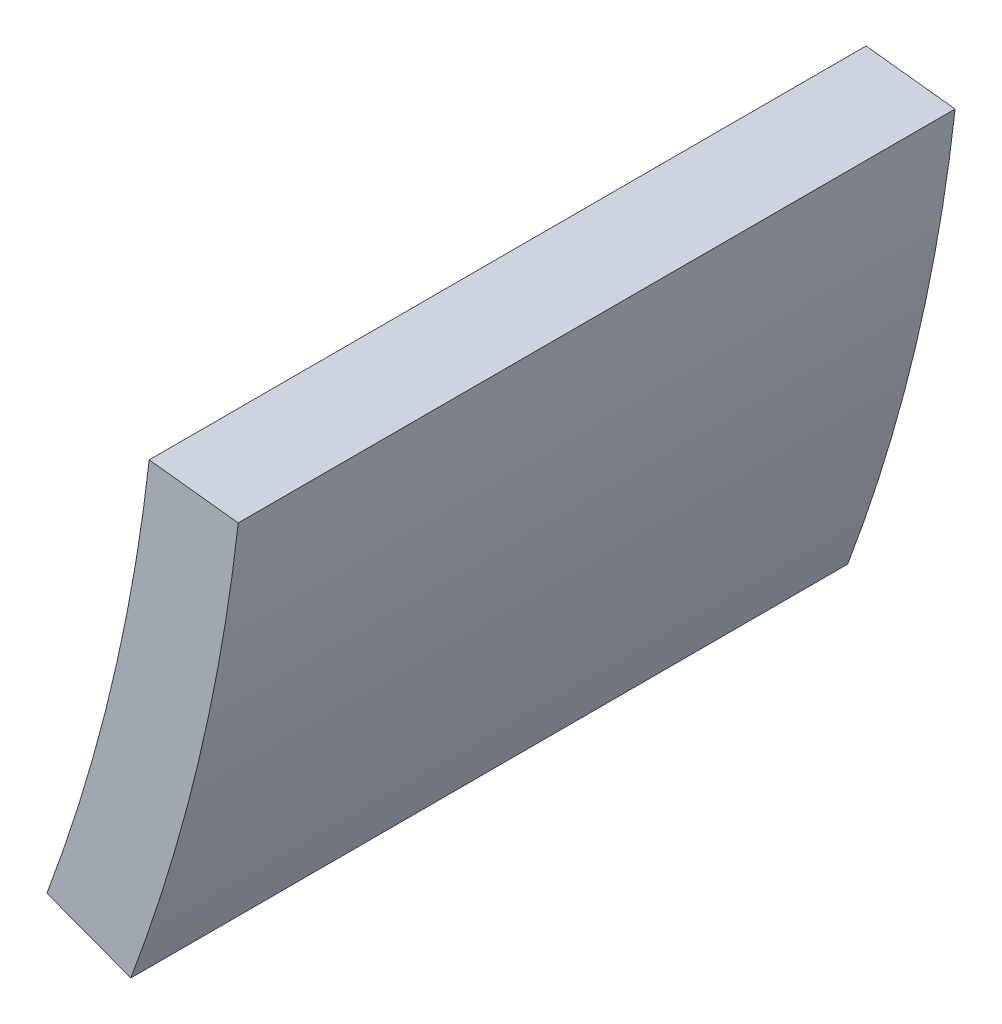
ISO-10303-21;
HEADER;
FILE_DESCRIPTION(('STEP AP214'),'2;1');
FILE_NAME('part.step','',(''),(''),'','','');
FILE_SCHEMA(('AUTOMOTIVE_DESIGN { 1 0 10303 214 1 1 1 1 }'));
ENDSEC;
DATA;
#1=APPLICATION_CONTEXT('core data for automotive mechanical design processes');
#2=APPLICATION_PROTOCOL_DEFINITION('international standard','automotive_design',2000,#1);
#3=PRODUCT_CONTEXT('',#1,'mechanical');
#4=PRODUCT('Part','Part','',(#3));
#5=PRODUCT_RELATED_PRODUCT_CATEGORY('part','',(#4));
#6=PRODUCT_DEFINITION_FORMATION('','',#4);
#7=PRODUCT_DEFINITION_CONTEXT('part definition',#1,'design');
#8=PRODUCT_DEFINITION('design','',#6,#7);
#9=PRODUCT_DEFINITION_SHAPE('','',#8);
#10=(LENGTH_UNIT() NAMED_UNIT(*) SI_UNIT(.MILLI.,.METRE.));
#11=(NAMED_UNIT(*) PLANE_ANGLE_UNIT() SI_UNIT($,.RADIAN.));
#12=(NAMED_UNIT(*) SI_UNIT($,.STERADIAN.) SOLID_ANGLE_UNIT());
#13=UNCERTAINTY_MEASURE_WITH_UNIT(LENGTH_MEASURE(1.E-05),#10,'distance_accuracy_value','');
#14=(GEOMETRIC_REPRESENTATION_CONTEXT(3) GLOBAL_UNCERTAINTY_ASSIGNED_CONTEXT((#13)) GLOBAL_UNIT_ASSIGNED_CONTEXT((#10,
#11,#12)) REPRESENTATION_CONTEXT('',''));
#15=CARTESIAN_POINT('',(0.,0.,0.));
#16=DIRECTION('',(0.,0.,1.));
#17=DIRECTION('',(1.,0.,0.));
#18=AXIS2_PLACEMENT_3D('',#15,#16,#17);
#19=CARTESIAN_POINT('',(-48.455993895013,3.52812743631809,10.));
#20=DIRECTION('',(-0.112189942894875,-0.993686779983132,0.));
#21=DIRECTION('',(-0.993686779983132,0.112189942894875,0.));
#22=AXIS2_PLACEMENT_3D('',#19,#20,#21);
#23=PLANE('',#22);
#24=DIRECTION('',(-0.993686779983132,0.112189942894875,0.));
#25=VECTOR('',#24,1.);
#26=CARTESIAN_POINT('',(-48.455993895013,3.52812743631809,-18.));
#27=LINE('',#26,#25);
#28=CARTESIAN_POINT('',(16.5633592561467,-3.81273455765363,-18.));
#29=VERTEX_POINT('',#28);
#30=CARTESIAN_POINT('',(12.3401904412758,-3.33592730035689,-18.));
#31=VERTEX_POINT('',#30);
#32=EDGE_CURVE('E11',#29,#31,#27,.T.);
#33=ORIENTED_EDGE('',*,*,#32,.T.);
#34=DIRECTION('',(0.,0.,-1.));
#35=VECTOR('',#34,1.);
#36=CARTESIAN_POINT('',(12.3401904412758,-3.33592730035689,10.));
#37=LINE('',#36,#35);
#38=CARTESIAN_POINT('',(12.3401904412758,-3.33592730035689,16.));
#39=VERTEX_POINT('',#38);
#40=EDGE_CURVE('E37',#39,#31,#37,.T.);
#41=ORIENTED_EDGE('',*,*,#40,.F.);
#42=DIRECTION('',(-0.993686779983132,0.112189942894875,0.));
#43=VECTOR('',#42,1.);
#44=CARTESIAN_POINT('',(-48.455993895013,3.52812743631809,16.));
#45=LINE('',#44,#43);
#46=CARTESIAN_POINT('',(16.5633592561467,-3.81273455765363,16.));
#47=VERTEX_POINT('',#46);
#48=EDGE_CURVE('E89',#47,#39,#45,.T.);
#49=ORIENTED_EDGE('',*,*,#48,.F.);
#50=DIRECTION('',(0.,0.,-1.));
#51=VECTOR('',#50,1.);
#52=CARTESIAN_POINT('',(16.5633592561467,-3.81273455765363,10.));
#53=LINE('',#52,#51);
#54=EDGE_CURVE('E28',#47,#29,#53,.T.);
#55=ORIENTED_EDGE('',*,*,#54,.T.);
#56=EDGE_LOOP('',(#33,#41,#49,#55));
#57=FACE_BOUND('',#56,.T.);
#58=ADVANCED_FACE('F17',(#57),#23,.F.);
#59=CARTESIAN_POINT('',(-71.8747641621128,6.17217036174182,10.));
#60=DIRECTION('',(0.,0.,-1.));
#61=DIRECTION('',(-1.,0.,0.));
#62=AXIS2_PLACEMENT_3D('',#59,#60,#61);
#63=CYLINDRICAL_SURFACE('',#62,88.9999999999587);
#64=CARTESIAN_POINT('',(-71.8747641621128,6.17217036174182,-18.));
#65=DIRECTION('',(0.,0.,1.));
#66=DIRECTION('',(-1.,0.,0.));
#67=AXIS2_PLACEMENT_3D('',#64,#65,#66);
#68=CIRCLE('',#67,88.9999999999587);
#69=CARTESIAN_POINT('',(11.4677829107651,-25.0531374413495,-18.));
#70=VERTEX_POINT('',#69);
#71=EDGE_CURVE('E75',#70,#29,#68,.T.);
#72=ORIENTED_EDGE('',*,*,#71,.T.);
#73=ORIENTED_EDGE('',*,*,#54,.F.);
#74=CARTESIAN_POINT('',(-71.8747641621128,6.17217036174182,16.));
#75=DIRECTION('',(0.,0.,1.));
#76=DIRECTION('',(-1.,0.,0.));
#77=AXIS2_PLACEMENT_3D('',#74,#75,#76);
#78=CIRCLE('',#77,88.9999999999587);
#79=CARTESIAN_POINT('',(11.4677829107651,-25.0531374413495,16.));
#80=VERTEX_POINT('',#79);
#81=EDGE_CURVE('E86',#80,#47,#78,.T.);
#82=ORIENTED_EDGE('',*,*,#81,.F.);
#83=DIRECTION('',(0.,0.,-1.));
#84=VECTOR('',#83,1.);
#85=CARTESIAN_POINT('',(11.4677829107651,-25.0531374413495,10.));
#86=LINE('',#85,#84);
#87=EDGE_CURVE('E21',#80,#70,#86,.T.);
#88=ORIENTED_EDGE('',*,*,#87,.T.);
#89=EDGE_LOOP('',(#72,#73,#82,#88));
#90=FACE_BOUND('',#89,.T.);
#91=ADVANCED_FACE('F102',(#90),#63,.T.);
#92=CARTESIAN_POINT('',(-43.6027884354967,-4.42027221781536,10.));
#93=DIRECTION('',(0.350846155084208,0.93643311318141,0.));
#94=DIRECTION('',(0.,0.,-1.));
#95=AXIS2_PLACEMENT_3D('',#92,#93,#94);
#96=PLANE('',#95);
#97=DIRECTION('',(0.93643311318141,-0.350846155084208,0.));
#98=VECTOR('',#97,1.);
#99=CARTESIAN_POINT('',(-43.6027884354967,-4.42027221781536,-18.));
#100=LINE('',#99,#98);
#101=CARTESIAN_POINT('',(7.48794217979824,-23.5620412822619,-18.));
#102=VERTEX_POINT('',#101);
#103=EDGE_CURVE('E65',#102,#70,#100,.T.);
#104=ORIENTED_EDGE('',*,*,#103,.T.);
#105=ORIENTED_EDGE('',*,*,#87,.F.);
#106=DIRECTION('',(0.93643311318141,-0.350846155084208,0.));
#107=VECTOR('',#106,1.);
#108=CARTESIAN_POINT('',(-43.6027884354967,-4.42027221781536,16.));
#109=LINE('',#108,#107);
#110=CARTESIAN_POINT('',(7.48794217979824,-23.5620412822619,16.));
#111=VERTEX_POINT('',#110);
#112=EDGE_CURVE('E60',#111,#80,#109,.T.);
#113=ORIENTED_EDGE('',*,*,#112,.F.);
#114=DIRECTION('',(0.,0.,-1.));
#115=VECTOR('',#114,1.);
#116=CARTESIAN_POINT('',(7.48794217979824,-23.5620412822619,10.));
#117=LINE('',#116,#115);
#118=EDGE_CURVE('E63',#111,#102,#117,.T.);
#119=ORIENTED_EDGE('',*,*,#118,.T.);
#120=EDGE_LOOP('',(#104,#105,#113,#119));
#121=FACE_BOUND('',#120,.T.);
#122=ADVANCED_FACE('F19',(#121),#96,.F.);
#123=CARTESIAN_POINT('',(-71.8747641621128,6.17217036174182,10.));
#124=DIRECTION('',(0.,0.,-1.));
#125=DIRECTION('',(-1.,0.,0.));
#126=AXIS2_PLACEMENT_3D('',#123,#124,#125);
#127=CYLINDRICAL_SURFACE('',#126,84.7500000000165);
#128=CARTESIAN_POINT('',(-71.8747641621128,6.17217036174182,-18.));
#129=DIRECTION('',(0.,0.,1.));
#130=DIRECTION('',(-1.,0.,0.));
#131=AXIS2_PLACEMENT_3D('',#128,#129,#130);
#132=CIRCLE('',#131,84.7500000000165);
#133=EDGE_CURVE('E74',#102,#31,#132,.T.);
#134=ORIENTED_EDGE('',*,*,#133,.F.);
#135=ORIENTED_EDGE('',*,*,#118,.F.);
#136=CARTESIAN_POINT('',(-71.8747641621128,6.17217036174182,16.));
#137=DIRECTION('',(0.,0.,1.));
#138=DIRECTION('',(-1.,0.,0.));
#139=AXIS2_PLACEMENT_3D('',#136,#137,#138);
#140=CIRCLE('',#139,84.7500000000165);
#141=EDGE_CURVE('E68',#111,#39,#140,.T.);
#142=ORIENTED_EDGE('',*,*,#141,.T.);
#143=ORIENTED_EDGE('',*,*,#40,.T.);
#144=EDGE_LOOP('',(#134,#135,#142,#143));
#145=FACE_BOUND('',#144,.T.);
#146=ADVANCED_FACE('F77',(#145),#127,.F.);
#147=CARTESIAN_POINT('',(-51.833752333337,-26.38929492376,-18.));
#148=DIRECTION('',(0.,0.,1.));
#149=DIRECTION('',(1.,0.,0.));
#150=AXIS2_PLACEMENT_3D('',#147,#148,#149);
#151=PLANE('',#150);
#152=ORIENTED_EDGE('',*,*,#133,.T.);
#153=ORIENTED_EDGE('',*,*,#32,.F.);
#154=ORIENTED_EDGE('',*,*,#71,.F.);
#155=ORIENTED_EDGE('',*,*,#103,.F.);
#156=EDGE_LOOP('',(#152,#153,#154,#155));
#157=FACE_BOUND('',#156,.T.);
#158=ADVANCED_FACE('F72',(#157),#151,.F.);
#159=CARTESIAN_POINT('',(-51.833752333337,-26.38929492376,16.));
#160=DIRECTION('',(0.,0.,1.));
#161=DIRECTION('',(1.,0.,0.));
#162=AXIS2_PLACEMENT_3D('',#159,#160,#161);
#163=PLANE('',#162);
#164=ORIENTED_EDGE('',*,*,#141,.F.);
#165=ORIENTED_EDGE('',*,*,#112,.T.);
#166=ORIENTED_EDGE('',*,*,#81,.T.);
#167=ORIENTED_EDGE('',*,*,#48,.T.);
#168=EDGE_LOOP('',(#164,#165,#166,#167));
#169=FACE_BOUND('',#168,.T.);
#170=ADVANCED_FACE('F99',(#169),#163,.T.);
#171=CLOSED_SHELL('',(#58,#91,#122,#146,#158,#170));
#172=MANIFOLD_SOLID_BREP('B1',#171);
#173=ADVANCED_BREP_SHAPE_REPRESENTATION('',(#18,#172),#14);
#174=SHAPE_DEFINITION_REPRESENTATION(#9,#173);
ENDSEC;
END-ISO-10303-21;
